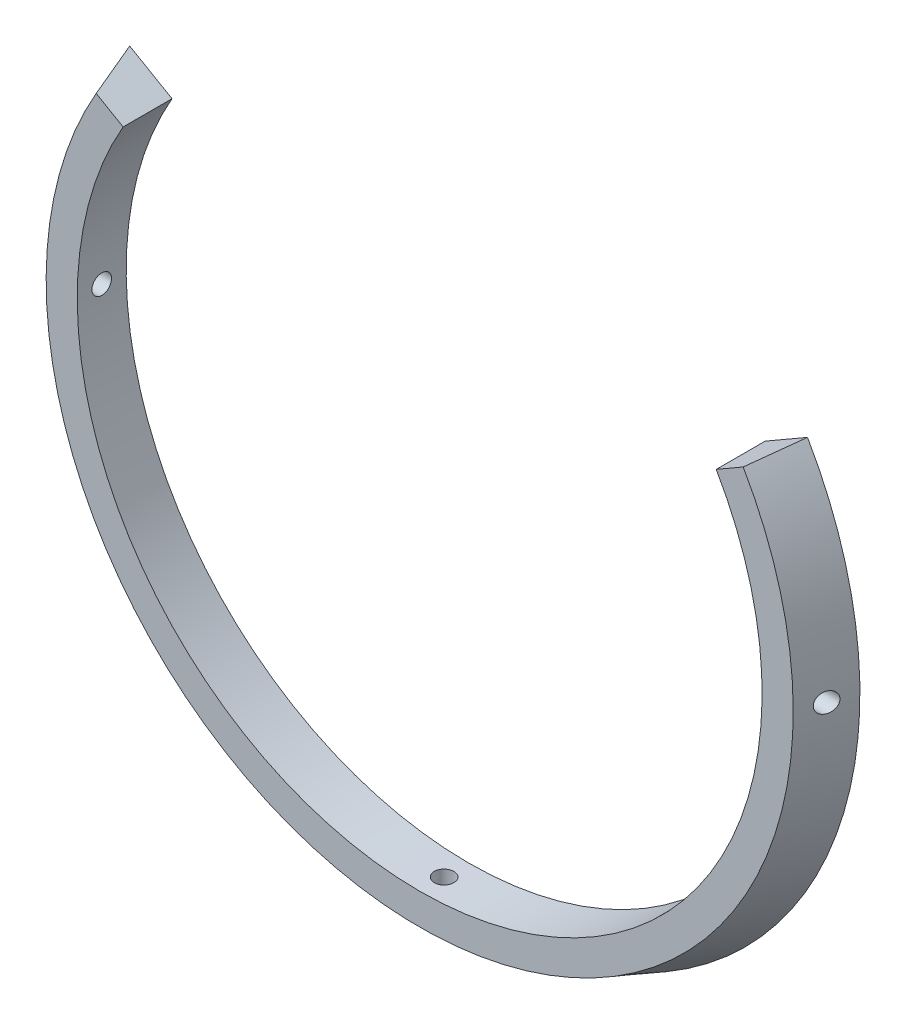
ISO-10303-21;
HEADER;
FILE_DESCRIPTION(('STEP AP214'),'2;1');
FILE_NAME('part.step','',(''),(''),'','','');
FILE_SCHEMA(('AUTOMOTIVE_DESIGN { 1 0 10303 214 1 1 1 1 }'));
ENDSEC;
DATA;
#1=APPLICATION_CONTEXT('core data for automotive mechanical design processes');
#2=APPLICATION_PROTOCOL_DEFINITION('international standard','automotive_design',2000,#1);
#3=PRODUCT_CONTEXT('',#1,'mechanical');
#4=PRODUCT('Part','Part','',(#3));
#5=PRODUCT_RELATED_PRODUCT_CATEGORY('part','',(#4));
#6=PRODUCT_DEFINITION_FORMATION('','',#4);
#7=PRODUCT_DEFINITION_CONTEXT('part definition',#1,'design');
#8=PRODUCT_DEFINITION('design','',#6,#7);
#9=PRODUCT_DEFINITION_SHAPE('','',#8);
#10=(LENGTH_UNIT() NAMED_UNIT(*) SI_UNIT(.MILLI.,.METRE.));
#11=(NAMED_UNIT(*) PLANE_ANGLE_UNIT() SI_UNIT($,.RADIAN.));
#12=(NAMED_UNIT(*) SI_UNIT($,.STERADIAN.) SOLID_ANGLE_UNIT());
#13=UNCERTAINTY_MEASURE_WITH_UNIT(LENGTH_MEASURE(1.E-05),#10,'distance_accuracy_value','');
#14=(GEOMETRIC_REPRESENTATION_CONTEXT(3) GLOBAL_UNCERTAINTY_ASSIGNED_CONTEXT((#13)) GLOBAL_UNIT_ASSIGNED_CONTEXT((#10,
#11,#12)) REPRESENTATION_CONTEXT('',''));
#15=CARTESIAN_POINT('',(0.,0.,0.));
#16=DIRECTION('',(0.,0.,1.));
#17=DIRECTION('',(1.,0.,0.));
#18=AXIS2_PLACEMENT_3D('',#15,#16,#17);
#19=CARTESIAN_POINT('',(0.,0.,10.));
#20=DIRECTION('',(0.,0.,1.));
#21=DIRECTION('',(1.,0.,0.));
#22=AXIS2_PLACEMENT_3D('',#19,#20,#21);
#23=PLANE('',#22);
#24=DIRECTION('',(-0.86602540378444,-0.499999999999998,0.));
#25=VECTOR('',#24,1.);
#26=CARTESIAN_POINT('',(60.6217782649107,35.0000000000001,10.));
#27=LINE('',#26,#25);
#28=CARTESIAN_POINT('',(66.129957611796,38.180148828669,10.));
#29=VERTEX_POINT('',#28);
#30=CARTESIAN_POINT('',(60.6217782649107,35.0000000000001,10.));
#31=VERTEX_POINT('',#30);
#32=EDGE_CURVE('E55',#29,#31,#27,.T.);
#33=ORIENTED_EDGE('',*,*,#32,.T.);
#34=CARTESIAN_POINT('',(0.,0.,10.));
#35=DIRECTION('',(0.,0.,1.));
#36=DIRECTION('',(1.,0.,0.));
#37=AXIS2_PLACEMENT_3D('',#34,#35,#36);
#38=CIRCLE('',#37,70.);
#39=CARTESIAN_POINT('',(-60.6217782649108,34.9999999999999,10.));
#40=VERTEX_POINT('',#39);
#41=EDGE_CURVE('E95',#40,#31,#38,.T.);
#42=ORIENTED_EDGE('',*,*,#41,.F.);
#43=DIRECTION('',(-0.866025403784439,0.499999999999999,0.));
#44=VECTOR('',#43,1.);
#45=CARTESIAN_POINT('',(-60.6217782649108,34.9999999999999,10.));
#46=LINE('',#45,#44);
#47=CARTESIAN_POINT('',(-66.1299576117961,38.1801488286688,10.));
#48=VERTEX_POINT('',#47);
#49=EDGE_CURVE('E79',#40,#48,#46,.T.);
#50=ORIENTED_EDGE('',*,*,#49,.T.);
#51=CARTESIAN_POINT('',(0.,0.,10.));
#52=DIRECTION('',(0.,0.,1.));
#53=DIRECTION('',(1.,0.,0.));
#54=AXIS2_PLACEMENT_3D('',#51,#52,#53);
#55=CIRCLE('',#54,76.3602976573379);
#56=EDGE_CURVE('E103',#48,#29,#55,.T.);
#57=ORIENTED_EDGE('',*,*,#56,.T.);
#58=EDGE_LOOP('',(#33,#42,#50,#57));
#59=FACE_BOUND('',#58,.T.);
#60=ADVANCED_FACE('F39',(#59),#23,.T.);
#61=CARTESIAN_POINT('',(0.,0.,0.));
#62=DIRECTION('',(0.,0.,1.));
#63=DIRECTION('',(1.,0.,0.));
#64=AXIS2_PLACEMENT_3D('',#61,#62,#63);
#65=PLANE('',#64);
#66=CARTESIAN_POINT('',(0.,0.,0.));
#67=DIRECTION('',(0.,0.,1.));
#68=DIRECTION('',(1.,0.,0.));
#69=AXIS2_PLACEMENT_3D('',#66,#67,#68);
#70=CIRCLE('',#69,70.);
#71=CARTESIAN_POINT('',(-60.6217782649108,34.9999999999999,0.));
#72=VERTEX_POINT('',#71);
#73=CARTESIAN_POINT('',(60.6217782649107,35.0000000000001,0.));
#74=VERTEX_POINT('',#73);
#75=EDGE_CURVE('E97',#72,#74,#70,.T.);
#76=ORIENTED_EDGE('',*,*,#75,.T.);
#77=DIRECTION('',(-0.86602540378444,-0.499999999999998,0.));
#78=VECTOR('',#77,1.);
#79=CARTESIAN_POINT('',(60.6217782649107,35.0000000000001,0.));
#80=LINE('',#79,#78);
#81=CARTESIAN_POINT('',(69.2820323027551,40.0000000000001,0.));
#82=VERTEX_POINT('',#81);
#83=EDGE_CURVE('E87',#82,#74,#80,.T.);
#84=ORIENTED_EDGE('',*,*,#83,.F.);
#85=CARTESIAN_POINT('',(0.,0.,0.));
#86=DIRECTION('',(0.,0.,1.));
#87=DIRECTION('',(1.,0.,0.));
#88=AXIS2_PLACEMENT_3D('',#85,#86,#87);
#89=CIRCLE('',#88,80.);
#90=CARTESIAN_POINT('',(-69.2820323027552,39.9999999999998,0.));
#91=VERTEX_POINT('',#90);
#92=EDGE_CURVE('E100',#91,#82,#89,.T.);
#93=ORIENTED_EDGE('',*,*,#92,.F.);
#94=DIRECTION('',(-0.866025403784439,0.499999999999999,0.));
#95=VECTOR('',#94,1.);
#96=CARTESIAN_POINT('',(-60.6217782649108,34.9999999999999,0.));
#97=LINE('',#96,#95);
#98=EDGE_CURVE('E63',#72,#91,#97,.T.);
#99=ORIENTED_EDGE('',*,*,#98,.F.);
#100=EDGE_LOOP('',(#76,#84,#93,#99));
#101=FACE_BOUND('',#100,.T.);
#102=ADVANCED_FACE('F140',(#101),#65,.F.);
#103=CARTESIAN_POINT('',(0.,0.,10.));
#104=DIRECTION('',(0.,0.,-1.));
#105=DIRECTION('',(-1.,0.,0.));
#106=AXIS2_PLACEMENT_3D('',#103,#104,#105);
#107=CYLINDRICAL_SURFACE('',#106,70.);
#108=DIRECTION('',(0.,0.,-1.));
#109=VECTOR('',#108,1.);
#110=CARTESIAN_POINT('',(60.6217782649107,35.0000000000001,10.));
#111=LINE('',#110,#109);
#112=EDGE_CURVE('E98',#31,#74,#111,.T.);
#113=ORIENTED_EDGE('',*,*,#112,.T.);
#114=ORIENTED_EDGE('',*,*,#75,.F.);
#115=DIRECTION('',(0.,0.,-1.));
#116=VECTOR('',#115,1.);
#117=CARTESIAN_POINT('',(-60.6217782649108,34.9999999999999,10.));
#118=LINE('',#117,#116);
#119=EDGE_CURVE('E82',#40,#72,#118,.T.);
#120=ORIENTED_EDGE('',*,*,#119,.F.);
#121=ORIENTED_EDGE('',*,*,#41,.T.);
#122=EDGE_LOOP('',(#113,#114,#120,#121));
#123=FACE_BOUND('',#122,.T.);
#124=CARTESIAN_POINT('',(-70.,0.,7.));
#125=CARTESIAN_POINT('',(-69.9999996149301,-0.112316286819579,6.9999950267639));
#126=CARTESIAN_POINT('',(-69.9997267795291,-0.22471342997171,6.99050703224014));
#127=CARTESIAN_POINT('',(-69.9986646136778,-0.446410553862827,6.9527901476384));
#128=CARTESIAN_POINT('',(-69.9978746658476,-0.555706669347092,6.92453885549852));
#129=CARTESIAN_POINT('',(-69.9958677372696,-0.767957929736816,6.85010179463942));
#130=CARTESIAN_POINT('',(-69.9946509649922,-0.87091614140713,6.80392478006115));
#131=CARTESIAN_POINT('',(-69.9919276478776,-1.06759056641175,6.69495957691114));
#132=CARTESIAN_POINT('',(-69.9904211739247,-1.16130903206028,6.63217545036122));
#133=CARTESIAN_POINT('',(-69.9872873693094,-1.33691253467475,6.49174660446556));
#134=CARTESIAN_POINT('',(-69.9856599954017,-1.41879330619821,6.41409655183108));
#135=CARTESIAN_POINT('',(-69.9824681885537,-1.56836130928542,6.24614917051025));
#136=CARTESIAN_POINT('',(-69.9809037581189,-1.63604797630621,6.15585133902119));
#137=CARTESIAN_POINT('',(-69.9780140529026,-1.7553123955798,5.96515663556667));
#138=CARTESIAN_POINT('',(-69.9766888146437,-1.80688768863881,5.86475822496678));
#139=CARTESIAN_POINT('',(-69.9744273153638,-1.89244927623031,5.65672329656314));
#140=CARTESIAN_POINT('',(-69.973491052855,-1.92643563804235,5.5490868064476));
#141=CARTESIAN_POINT('',(-69.9721133803398,-1.97584572344314,5.32966240508293));
#142=CARTESIAN_POINT('',(-69.9716718344362,-1.99127454481841,5.21787564262265));
#143=CARTESIAN_POINT('',(-69.9713329721672,-2.00314728057876,4.99329793715254));
#144=CARTESIAN_POINT('',(-69.9714356537402,-1.99959126688359,4.88050699794842));
#145=CARTESIAN_POINT('',(-69.9721735406433,-1.97359959837663,4.65715724822532));
#146=CARTESIAN_POINT('',(-69.9728085904297,-1.95116945807543,4.54659779538663));
#147=CARTESIAN_POINT('',(-69.9745393792642,-1.88807477316335,4.33081424240121));
#148=CARTESIAN_POINT('',(-69.9756351192776,-1.84741019035064,4.22559015343278));
#149=CARTESIAN_POINT('',(-69.9781639448389,-1.74899461408696,4.02344654515124));
#150=CARTESIAN_POINT('',(-69.9795970802915,-1.69124109265352,3.92652825726049));
#151=CARTESIAN_POINT('',(-69.9826390852555,-1.56028893983692,3.74376093497471));
#152=CARTESIAN_POINT('',(-69.9842479551246,-1.48709027702538,3.65791192310447));
#153=CARTESIAN_POINT('',(-69.9874607520489,-1.32729448416521,3.499687961224));
#154=CARTESIAN_POINT('',(-69.9890646771303,-1.24069257101229,3.42731784170601));
#155=CARTESIAN_POINT('',(-69.992086216381,-1.05656547595005,3.29814318835196));
#156=CARTESIAN_POINT('',(-69.9935038305206,-0.959040292307037,3.24133865698642));
#157=CARTESIAN_POINT('',(-69.9959929601536,-0.755832383316455,3.14490820999497));
#158=CARTESIAN_POINT('',(-69.9970644726067,-0.650149586319754,3.10528244527212));
#159=CARTESIAN_POINT('',(-69.998740560809,-0.433627626635332,3.04433744976672));
#160=CARTESIAN_POINT('',(-69.9993451377131,-0.32278847670069,3.02301817370973));
#161=CARTESIAN_POINT('',(-70.0000190557424,-0.0991421242368263,2.99929725237571));
#162=CARTESIAN_POINT('',(-70.0000885859641,0.0136643688651155,2.99688892358131));
#163=CARTESIAN_POINT('',(-69.9996850736081,0.238080082195189,3.0110408451527));
#164=CARTESIAN_POINT('',(-69.9992120315984,0.34968930367652,3.0276010756619));
#165=CARTESIAN_POINT('',(-69.9977768109445,0.568523644914071,3.0792144975015));
#166=CARTESIAN_POINT('',(-69.9968147125393,0.675749480732105,3.11426465523893));
#167=CARTESIAN_POINT('',(-69.9945097982842,0.88279525980865,3.20185990010615));
#168=CARTESIAN_POINT('',(-69.9931669817451,0.982615189661706,3.25440501890269));
#169=CARTESIAN_POINT('',(-69.9902514416955,1.17204638387366,3.37551582705261));
#170=CARTESIAN_POINT('',(-69.9886786536726,1.26165477106143,3.44408601505651));
#171=CARTESIAN_POINT('',(-69.9854806448697,1.42809032373543,3.59529389364271));
#172=CARTESIAN_POINT('',(-69.9838554239662,1.50491745912272,3.67793161735211));
#173=CARTESIAN_POINT('',(-69.9807352286952,1.64363195956651,3.85495740843334));
#174=CARTESIAN_POINT('',(-69.9792402920053,1.70551501194769,3.94934885589982));
#175=CARTESIAN_POINT('',(-69.9765498058537,1.81255521173305,4.1471853836391));
#176=CARTESIAN_POINT('',(-69.9753542557507,1.85771239495969,4.25063044452081));
#177=CARTESIAN_POINT('',(-69.9733976072276,1.93001145871094,4.46362152081525));
#178=CARTESIAN_POINT('',(-69.9726364414488,1.95715613248458,4.5731665874263));
#179=CARTESIAN_POINT('',(-69.9716341916415,1.99266879934611,4.7952615576871));
#180=CARTESIAN_POINT('',(-69.9713931072851,2.00103680426867,4.9078114594429));
#181=CARTESIAN_POINT('',(-69.9714582263741,1.99875826618365,5.13267799559717));
#182=CARTESIAN_POINT('',(-69.9717642339433,1.98811852855175,5.24499469907439));
#183=CARTESIAN_POINT('',(-69.9728886283733,1.94814051555171,5.46624698819508));
#184=CARTESIAN_POINT('',(-69.9737070162513,1.91880220305912,5.57518256712514));
#185=CARTESIAN_POINT('',(-69.9757638856832,1.84226071428733,5.78658309985461));
#186=CARTESIAN_POINT('',(-69.9770023743709,1.79505723463408,5.88904794373794));
#187=CARTESIAN_POINT('',(-69.9797597735442,1.68412788465913,6.08459612389776));
#188=CARTESIAN_POINT('',(-69.9812786738076,1.62040261659421,6.17767980196738));
#189=CARTESIAN_POINT('',(-69.9844262043485,1.47821932776609,6.35185415650389));
#190=CARTESIAN_POINT('',(-69.9860548621276,1.39975760566038,6.43294181077273));
#191=CARTESIAN_POINT('',(-69.9892384419302,1.23031167777013,6.58081590412606));
#192=CARTESIAN_POINT('',(-69.9907933455894,1.13932437498507,6.64759879582973));
#193=CARTESIAN_POINT('',(-69.9936546482795,0.947376333784992,6.76497796729639));
#194=CARTESIAN_POINT('',(-69.9949608895645,0.84640932575075,6.81556398590642));
#195=CARTESIAN_POINT('',(-69.997174758846,0.637489831058708,6.89900777180388));
#196=CARTESIAN_POINT('',(-69.9980828621709,0.529545851780355,6.93188668999595));
#197=CARTESIAN_POINT('',(-69.999155297125,0.350766202848949,6.97026513018611));
#198=CARTESIAN_POINT('',(-69.9994706871964,0.281091074513447,6.98140168654489));
#199=CARTESIAN_POINT('',(-69.9998931594471,0.140954580982318,6.99627068114412));
#200=CARTESIAN_POINT('',(-70.0000002416819,0.0704932159963146,7.00000312135859));
#201=CARTESIAN_POINT('',(-70.,0.,7.));
#202=B_SPLINE_CURVE_WITH_KNOTS('',3,(#124,#125,#126,#127,#128,#129,#130,#131,#132,#133,#134,
#135,#136,#137,#138,#139,#140,#141,#142,#143,#144,#145,#146,#147,#148,#149,#150,#151,#152,#153,
#154,#155,#156,#157,#158,#159,#160,#161,#162,#163,#164,#165,#166,#167,#168,#169,#170,#171,#172,
#173,#174,#175,#176,#177,#178,#179,#180,#181,#182,#183,#184,#185,#186,#187,#188,#189,#190,#191,
#192,#193,#194,#195,#196,#197,#198,#199,#200,#201),.UNSPECIFIED.,.T.,.F.,(4,2,2,2,2,2,2,2,2,2,2,
2,2,2,2,2,2,2,2,2,2,2,2,2,2,2,2,2,2,2,2,2,2,2,2,2,2,2,4),(0.,0.33669155192478,0.673785814333229,
1.01071566128574,1.34756317285995,1.68453175883004,2.02151374453114,2.35854714108932,
2.69557924844919,3.03251875138119,3.36945697789516,3.70629679431785,4.04313731643577,
4.38002769261651,4.71691875432201,5.053930317878,5.39094193492301,5.72795651231158,
6.06497025621467,6.401864887172,6.73875916546293,7.07559818759242,7.41243781942056,
7.74937212465422,8.08630722333276,8.42333944137427,8.76037093757629,9.09735015716261,
9.43432916435557,9.77118754653683,10.1080465975243,10.4449113690785,10.7817638628713,
11.118701077036,11.4557217504231,11.7929555149021,12.1297855594659,12.3411037689078,
12.5524219220096),.UNSPECIFIED.);
#203=CARTESIAN_POINT('',(-70.,0.,7.));
#204=VERTEX_POINT('',#203);
#205=EDGE_CURVE('E122',#204,#204,#202,.T.);
#206=ORIENTED_EDGE('',*,*,#205,.F.);
#207=EDGE_LOOP('',(#206));
#208=FACE_BOUND('',#207,.T.);
#209=CARTESIAN_POINT('',(69.9714227381436,-1.99999999999976,5.));
#210=CARTESIAN_POINT('',(69.9714231238183,-1.99999502675404,5.11231627626728));
#211=CARTESIAN_POINT('',(69.9716960736724,-1.9905070339528,5.2247134089035));
#212=CARTESIAN_POINT('',(69.9727586480219,-1.95279015681525,5.44641051094482));
#213=CARTESIAN_POINT('',(69.9735488901127,-1.92453887038146,5.55570661508697));
#214=CARTESIAN_POINT('',(69.9755564575778,-1.85010182621802,5.76795785150267));
#215=CARTESIAN_POINT('',(69.9767735744503,-1.80392482290176,5.87091605063715));
#216=CARTESIAN_POINT('',(69.9794974800477,-1.69495964626504,6.06759045467621));
#217=CARTESIAN_POINT('',(69.9810041979133,-1.63217553493837,6.16130891187906));
#218=CARTESIAN_POINT('',(69.9841382834661,-1.49174670435497,6.33691242418744));
#219=CARTESIAN_POINT('',(69.9857656943517,-1.41409664841504,6.41879321113774));
#220=CARTESIAN_POINT('',(69.9889573514533,-1.24614925402665,6.56836124395446));
#221=CARTESIAN_POINT('',(69.9905215951553,-1.15585141281731,6.63604792532515));
#222=CARTESIAN_POINT('',(69.9934107848757,-0.965156701002657,6.7553123594821));
#223=CARTESIAN_POINT('',(69.9947356943895,-0.864758293432882,6.80688765574423));
#224=CARTESIAN_POINT('',(69.99699653843,-0.6567233716185,6.89244925009598));
#225=CARTESIAN_POINT('',(69.9979324744437,-0.549086885046034,6.92643561542612));
#226=CARTESIAN_POINT('',(69.9993096395834,-0.329662493895554,6.97584570835971));
#227=CARTESIAN_POINT('',(69.9997510045732,-0.217875738161317,6.99127453399525));
#228=CARTESIAN_POINT('',(70.0000897297399,0.00670195418632373,7.00314728060595));
#229=CARTESIAN_POINT('',(69.9999870919762,0.119492886996381,6.99959127345613));
#230=CARTESIAN_POINT('',(69.9992494982118,0.34284266594091,6.97359961517955));
#231=CARTESIAN_POINT('',(69.9986146975092,0.453402153627216,6.95116947197816));
#232=CARTESIAN_POINT('',(69.9968845028025,0.669185774814628,6.88807476913466));
#233=CARTESIAN_POINT('',(69.9957891078353,0.774409897156294,6.84741017135516));
#234=CARTESIAN_POINT('',(69.9932609176104,0.97655354537753,6.74899456437675));
#235=CARTESIAN_POINT('',(69.9918280725097,1.0734718415578,6.69124103073276));
#236=CARTESIAN_POINT('',(69.9887864660215,1.25623917521772,6.56028885200202));
#237=CARTESIAN_POINT('',(69.9871777042759,1.34208819016688,6.48709017547893));
#238=CARTESIAN_POINT('',(69.9839648944655,1.50031213606595,6.32729437305403));
#239=CARTESIAN_POINT('',(69.9823608482914,1.57268223930589,6.24069246680546));
#240=CARTESIAN_POINT('',(69.9793388901707,1.70185686313033,6.05656539129828));
#241=CARTESIAN_POINT('',(69.9779209782541,1.75866138121188,5.95904022028323));
#242=CARTESIAN_POINT('',(69.9754312067162,1.8550918187047,5.75583231436665));
#243=CARTESIAN_POINT('',(69.9743593502185,1.89471758305117,5.65014950583999));
#244=CARTESIAN_POINT('',(69.9726826787657,1.9556625742554,5.43362752114664));
#245=CARTESIAN_POINT('',(69.9720778626536,1.97698184645549,5.32278835775215));
#246=CARTESIAN_POINT('',(69.9714036762256,2.00070275329976,5.09914199958247));
#247=CARTESIAN_POINT('',(69.971334116635,2.00311107513912,4.98633551462495));
#248=CARTESIAN_POINT('',(69.9717377926111,1.98895914256621,4.76191981926658));
#249=CARTESIAN_POINT('',(69.9722110276096,1.97239890800966,4.65031060761257));
#250=CARTESIAN_POINT('',(69.9736467719771,1.92078548785051,4.43147631245504));
#251=CARTESIAN_POINT('',(69.9746092009764,1.88573533992478,4.32425051192518));
#252=CARTESIAN_POINT('',(69.9769147691608,1.79814012653355,4.11720479906834));
#253=CARTESIAN_POINT('',(69.9782579090362,1.74559502934409,4.01738490017104));
#254=CARTESIAN_POINT('',(69.9811739475789,1.62448425250762,3.82795372619314));
#255=CARTESIAN_POINT('',(69.9827469107957,1.55591406871079,3.73834533179986));
#256=CARTESIAN_POINT('',(69.9859450444677,1.40470619449625,3.57190976262062));
#257=CARTESIAN_POINT('',(69.9875702150457,1.32206847098502,3.49508261790305));
#258=CARTESIAN_POINT('',(69.9906901062704,1.14504267565838,3.35636809851705));
#259=CARTESIAN_POINT('',(69.9921847891808,1.05065122374696,3.29448503652385));
#260=CARTESIAN_POINT('',(69.9948746753992,0.852814684669638,3.18744481984658));
#261=CARTESIAN_POINT('',(69.9960698793486,0.749369616894758,3.14228762934014));
#262=CARTESIAN_POINT('',(69.9980258949552,0.536378545943138,3.06998856049731));
#263=CARTESIAN_POINT('',(69.9987867740378,0.426833492636352,3.04284388576616));
#264=CARTESIAN_POINT('',(69.9997886356965,0.204738550335595,3.00733121247719));
#265=CARTESIAN_POINT('',(70.0000296185984,0.0921886632243267,2.99896320215497));
#266=CARTESIAN_POINT('',(69.9999645264886,-0.132677883185284,3.00124172501293));
#267=CARTESIAN_POINT('',(69.9996586470866,-0.244994611496783,3.01188145922468));
#268=CARTESIAN_POINT('',(69.9985346821139,-0.466246951108139,3.05185947414586));
#269=CARTESIAN_POINT('',(69.9977165955274,-0.575182555702697,3.08119779193503));
#270=CARTESIAN_POINT('',(69.995660369941,-0.786583138015269,3.1577393003993));
#271=CARTESIAN_POINT('',(69.9944222238089,-0.889048005830298,3.20494279441239));
#272=CARTESIAN_POINT('',(69.9916654008008,-1.08459622782332,3.3158721804715));
#273=CARTESIAN_POINT('',(69.9901467341515,-1.17767992380908,3.37959747023504));
#274=CARTESIAN_POINT('',(69.9869994602913,-1.35185427591267,3.5217807823478));
#275=CARTESIAN_POINT('',(69.9853708255623,-1.43294191384796,3.60024250111976));
#276=CARTESIAN_POINT('',(69.9821870705158,-1.58081597581039,3.76968841570422));
#277=CARTESIAN_POINT('',(69.980631968508,-1.64759885241486,3.86067570855232));
#278=CARTESIAN_POINT('',(69.9777701343522,-1.76497800828903,4.05262374225482));
#279=CARTESIAN_POINT('',(69.9764635599095,-1.81556402351624,4.1535907544926));
#280=CARTESIAN_POINT('',(69.9742490364097,-1.89900780191096,4.36251025821094));
#281=CARTESIAN_POINT('',(69.973340612009,-1.93188671603773,4.47045424228924));
#282=CARTESIAN_POINT('',(69.9722677777788,-1.97026514435515,4.64923388028236));
#283=CARTESIAN_POINT('',(69.9719522635747,-1.9814016953847,4.71890899204159));
#284=CARTESIAN_POINT('',(69.9715296227542,-1.99627068290073,4.85904545233529));
#285=CARTESIAN_POINT('',(69.9714224960822,-2.00000312136394,4.92950680065986));
#286=CARTESIAN_POINT('',(69.9714227381436,-1.99999999999976,5.));
#287=B_SPLINE_CURVE_WITH_KNOTS('',3,(#209,#210,#211,#212,#213,#214,#215,#216,#217,#218,#219,
#220,#221,#222,#223,#224,#225,#226,#227,#228,#229,#230,#231,#232,#233,#234,#235,#236,#237,#238,
#239,#240,#241,#242,#243,#244,#245,#246,#247,#248,#249,#250,#251,#252,#253,#254,#255,#256,#257,
#258,#259,#260,#261,#262,#263,#264,#265,#266,#267,#268,#269,#270,#271,#272,#273,#274,#275,#276,
#277,#278,#279,#280,#281,#282,#283,#284,#285,#286),.UNSPECIFIED.,.T.,.F.,(4,2,2,2,2,2,2,2,2,2,2,
2,2,2,2,2,2,2,2,2,2,2,2,2,2,2,2,2,2,2,2,2,2,2,2,2,2,2,4),(0.,0.336691520235285,
0.673785751642736,1.01071556244788,1.34756303843135,1.68453166585155,2.02151369188248,
2.35854707295776,2.69557916558276,3.03251864931804,3.36945685742908,3.70629677298028,
4.04313739303613,4.38002779738141,4.71691888742463,5.05393040988238,5.39094198653128,
5.72795660516683,6.06497038906744,6.40186499447931,6.73875924724048,7.07559816943898,
7.41243770243796,7.74937202458294,8.08630713936774,8.42333937352027,8.7603708858353,
9.09735006266342,9.43432902835954,9.77118748261707,10.1080466048751,10.4449114470183,
10.7817640108793,11.118701182514,11.4557218143517,11.7929555972975,12.1297856592767,
12.3411038188292,12.552421921965),.UNSPECIFIED.);
#288=CARTESIAN_POINT('',(69.9714227381436,-1.99999999999976,5.));
#289=VERTEX_POINT('',#288);
#290=EDGE_CURVE('E144',#289,#289,#287,.T.);
#291=ORIENTED_EDGE('',*,*,#290,.F.);
#292=EDGE_LOOP('',(#291));
#293=FACE_BOUND('',#292,.T.);
#294=CARTESIAN_POINT('',(0.,-70.,7.));
#295=CARTESIAN_POINT('',(0.112316286819579,-69.9999996149301,6.99999502676388));
#296=CARTESIAN_POINT('',(0.224713429971709,-69.9997267795291,6.99050703224011));
#297=CARTESIAN_POINT('',(0.446410553862821,-69.9986646136778,6.95279014763834));
#298=CARTESIAN_POINT('',(0.555706669347082,-69.9978746658476,6.92453885549845));
#299=CARTESIAN_POINT('',(0.767957929736797,-69.9958677372696,6.85010179463933));
#300=CARTESIAN_POINT('',(0.870916141407106,-69.9946509649922,6.80392478006104));
#301=CARTESIAN_POINT('',(1.06759056641172,-69.9919276478776,6.69495957691101));
#302=CARTESIAN_POINT('',(1.16130903206023,-69.9904211739247,6.63217545036108));
#303=CARTESIAN_POINT('',(1.33691253467469,-69.9872873693094,6.49174660446539));
#304=CARTESIAN_POINT('',(1.41879330619814,-69.9856599954017,6.41409655183091));
#305=CARTESIAN_POINT('',(1.56836130928533,-69.9824681885537,6.24614917051006));
#306=CARTESIAN_POINT('',(1.63604797630611,-69.9809037581189,6.15585133902099));
#307=CARTESIAN_POINT('',(1.75531239557967,-69.9780140529026,5.96515663556645));
#308=CARTESIAN_POINT('',(1.80688768863867,-69.9766888146437,5.86475822496655));
#309=CARTESIAN_POINT('',(1.89244927623015,-69.9744273153638,5.65672329656291));
#310=CARTESIAN_POINT('',(1.92643563804217,-69.973491052855,5.54908680644736));
#311=CARTESIAN_POINT('',(1.97584572344294,-69.9721133803398,5.32966240508269));
#312=CARTESIAN_POINT('',(1.99127454481819,-69.9716718344362,5.21787564262241));
#313=CARTESIAN_POINT('',(2.00314728057852,-69.9713329721672,4.9932979371523));
#314=CARTESIAN_POINT('',(1.99959126688333,-69.9714356537402,4.88050699794818));
#315=CARTESIAN_POINT('',(1.97359959837635,-69.9721735406434,4.65715724822507));
#316=CARTESIAN_POINT('',(1.95116945807513,-69.9728085904297,4.54659779538639));
#317=CARTESIAN_POINT('',(1.88807477316303,-69.9745393792642,4.33081424240098));
#318=CARTESIAN_POINT('',(1.8474101903503,-69.9756351192776,4.22559015343256));
#319=CARTESIAN_POINT('',(1.7489946140866,-69.9781639448389,4.02344654515103));
#320=CARTESIAN_POINT('',(1.69124109265314,-69.9795970802915,3.92652825726028));
#321=CARTESIAN_POINT('',(1.56028893983653,-69.9826390852555,3.74376093497452));
#322=CARTESIAN_POINT('',(1.48709027702497,-69.9842479551246,3.65791192310429));
#323=CARTESIAN_POINT('',(1.32729448416478,-69.9874607520489,3.49968796122384));
#324=CARTESIAN_POINT('',(1.24069257101185,-69.9890646771303,3.42731784170585));
#325=CARTESIAN_POINT('',(1.0565654759496,-69.992086216381,3.29814318835183));
#326=CARTESIAN_POINT('',(0.959040292306577,-69.9935038305206,3.2413386569863));
#327=CARTESIAN_POINT('',(0.755832383315983,-69.9959929601536,3.14490820999488));
#328=CARTESIAN_POINT('',(0.650149586319278,-69.9970644726067,3.10528244527204));
#329=CARTESIAN_POINT('',(0.433627626634848,-69.998740560809,3.04433744976667));
#330=CARTESIAN_POINT('',(0.322788476700203,-69.9993451377131,3.02301817370969));
#331=CARTESIAN_POINT('',(0.0991421242363362,-70.0000190557424,2.9992972523757));
#332=CARTESIAN_POINT('',(-0.0136643688656057,-70.0000885859641,2.99688892358131));
#333=CARTESIAN_POINT('',(-0.238080082195677,-69.9996850736081,3.01104084515273));
#334=CARTESIAN_POINT('',(-0.349689303677007,-69.9992120315984,3.02760107566194));
#335=CARTESIAN_POINT('',(-0.568523644914551,-69.9977768109445,3.07921449750157));
#336=CARTESIAN_POINT('',(-0.67574948073258,-69.9968147125393,3.11426465523901));
#337=CARTESIAN_POINT('',(-0.882795259809115,-69.9945097982842,3.20185990010626));
#338=CARTESIAN_POINT('',(-0.982615189662164,-69.9931669817451,3.25440501890281));
#339=CARTESIAN_POINT('',(-1.1720463838741,-69.9902514416955,3.37551582705275));
#340=CARTESIAN_POINT('',(-1.26165477106187,-69.9886786536726,3.44408601505667));
#341=CARTESIAN_POINT('',(-1.42809032373585,-69.9854806448697,3.59529389364288));
#342=CARTESIAN_POINT('',(-1.50491745912313,-69.9838554239662,3.67793161735229));
#343=CARTESIAN_POINT('',(-1.64363195956689,-69.9807352286952,3.85495740843354));
#344=CARTESIAN_POINT('',(-1.70551501194806,-69.9792402920053,3.94934885590003));
#345=CARTESIAN_POINT('',(-1.8125552117334,-69.9765498058537,4.14718538363932));
#346=CARTESIAN_POINT('',(-1.85771239496003,-69.9753542557507,4.25063044452104));
#347=CARTESIAN_POINT('',(-1.93001145871125,-69.9733976072276,4.46362152081549));
#348=CARTESIAN_POINT('',(-1.95715613248488,-69.9726364414488,4.57316658742654));
#349=CARTESIAN_POINT('',(-1.99266879934638,-69.9716341916415,4.79526155768735));
#350=CARTESIAN_POINT('',(-2.00103680426893,-69.9713931072851,4.90781145944315));
#351=CARTESIAN_POINT('',(-1.99875826618387,-69.9714582263741,5.13267799559741));
#352=CARTESIAN_POINT('',(-1.98811852855196,-69.9717642339433,5.24499469907464));
#353=CARTESIAN_POINT('',(-1.9481405155519,-69.9728886283733,5.46624698819532));
#354=CARTESIAN_POINT('',(-1.9188022030593,-69.9737070162513,5.57518256712538));
#355=CARTESIAN_POINT('',(-1.84226071428748,-69.9757638856832,5.78658309985484));
#356=CARTESIAN_POINT('',(-1.79505723463422,-69.9770023743709,5.88904794373816));
#357=CARTESIAN_POINT('',(-1.68412788465924,-69.9797597735442,6.08459612389797));
#358=CARTESIAN_POINT('',(-1.62040261659431,-69.9812786738076,6.17767980196757));
#359=CARTESIAN_POINT('',(-1.47821932776616,-69.9844262043485,6.35185415650407));
#360=CARTESIAN_POINT('',(-1.39975760566045,-69.9860548621276,6.4329418107729));
#361=CARTESIAN_POINT('',(-1.23031167777018,-69.9892384419302,6.58081590412621));
#362=CARTESIAN_POINT('',(-1.13932437498511,-69.9907933455894,6.64759879582988));
#363=CARTESIAN_POINT('',(-0.94737633378502,-69.9936546482795,6.7649779672965));
#364=CARTESIAN_POINT('',(-0.846409325750771,-69.9949608895645,6.81556398590652));
#365=CARTESIAN_POINT('',(-0.637489831058719,-69.997174758846,6.89900777180396));
#366=CARTESIAN_POINT('',(-0.529545851780362,-69.9980828621709,6.93188668999602));
#367=CARTESIAN_POINT('',(-0.350766202848951,-69.999155297125,6.97026513018616));
#368=CARTESIAN_POINT('',(-0.281091074513448,-69.9994706871964,6.98140168654493));
#369=CARTESIAN_POINT('',(-0.140954580982317,-69.9998931594471,6.99627068114414));
#370=CARTESIAN_POINT('',(-0.0704932159963141,-70.0000002416819,7.0000031213586));
#371=CARTESIAN_POINT('',(0.,-70.,7.));
#372=B_SPLINE_CURVE_WITH_KNOTS('',3,(#294,#295,#296,#297,#298,#299,#300,#301,#302,#303,#304,
#305,#306,#307,#308,#309,#310,#311,#312,#313,#314,#315,#316,#317,#318,#319,#320,#321,#322,#323,
#324,#325,#326,#327,#328,#329,#330,#331,#332,#333,#334,#335,#336,#337,#338,#339,#340,#341,#342,
#343,#344,#345,#346,#347,#348,#349,#350,#351,#352,#353,#354,#355,#356,#357,#358,#359,#360,#361,
#362,#363,#364,#365,#366,#367,#368,#369,#370,#371),.UNSPECIFIED.,.T.,.F.,(4,2,2,2,2,2,2,2,2,2,2,
2,2,2,2,2,2,2,2,2,2,2,2,2,2,2,2,2,2,2,2,2,2,2,2,2,2,2,4),(0.,0.33669155192478,0.673785814333229,
1.01071566128574,1.34756317285995,1.68453175883004,2.02151374453114,2.35854714108932,
2.69557924844919,3.03251875138119,3.36945697789516,3.70629679431785,4.04313731643576,
4.38002769261651,4.71691875432201,5.053930317878,5.39094193492301,5.72795651231158,
6.06497025621467,6.401864887172,6.73875916546293,7.07559818759242,7.41243781942056,
7.74937212465422,8.08630722333276,8.42333944137427,8.76037093757629,9.09735015716262,
9.43432916435557,9.77118754653683,10.1080465975243,10.4449113690785,10.7817638628713,
11.118701077036,11.4557217504231,11.7929555149021,12.1297855594659,12.3411037689078,
12.5524219220096),.UNSPECIFIED.);
#373=CARTESIAN_POINT('',(0.,-70.,7.));
#374=VERTEX_POINT('',#373);
#375=EDGE_CURVE('E105',#374,#374,#372,.T.);
#376=ORIENTED_EDGE('',*,*,#375,.F.);
#377=EDGE_LOOP('',(#376));
#378=FACE_BOUND('',#377,.T.);
#379=ADVANCED_FACE('F93',(#123,#208,#293,#378),#107,.F.);
#380=CARTESIAN_POINT('',(0.,0.,10.));
#381=DIRECTION('',(0.,0.,-1.));
#382=DIRECTION('',(-1.,0.,0.));
#383=AXIS2_PLACEMENT_3D('',#380,#381,#382);
#384=CONICAL_SURFACE('',#383,76.3602976573379,0.349065850398863);
#385=DIRECTION('',(-0.296198132726022,-0.171010071662832,0.93969262078591));
#386=VECTOR('',#385,1.);
#387=CARTESIAN_POINT('',(-1.42247325030098E-13,2.46379594192894E-13,219.798193556372));
#388=LINE('',#387,#386);
#389=EDGE_CURVE('E11',#29,#82,#388,.F.);
#390=ORIENTED_EDGE('',*,*,#389,.F.);
#391=ORIENTED_EDGE('',*,*,#56,.F.);
#392=DIRECTION('',(-0.296198132726021,0.171010071662832,-0.939692620785909));
#393=VECTOR('',#392,1.);
#394=CARTESIAN_POINT('',(0.,0.,219.798193556372));
#395=LINE('',#394,#393);
#396=EDGE_CURVE('E49',#91,#48,#395,.F.);
#397=ORIENTED_EDGE('',*,*,#396,.F.);
#398=ORIENTED_EDGE('',*,*,#92,.T.);
#399=EDGE_LOOP('',(#390,#391,#397,#398));
#400=FACE_BOUND('',#399,.T.);
#401=CARTESIAN_POINT('',(-78.7244408697353,-1.29437129084692,3.47533420978428));
#402=CARTESIAN_POINT('',(-78.6954332186692,-1.38348539736046,3.55099516256373));
#403=CARTESIAN_POINT('',(-78.6636690261531,-1.46552357663833,3.63413071584875));
#404=CARTESIAN_POINT('',(-78.5958783569312,-1.61340259821545,3.81239835713068));
#405=CARTESIAN_POINT('',(-78.5598431930401,-1.67920955904651,3.90755492275232));
#406=CARTESIAN_POINT('',(-78.4848850667934,-1.79299145607604,4.10653967544397));
#407=CARTESIAN_POINT('',(-78.4459707881248,-1.84101758560648,4.21034189662798));
#408=CARTESIAN_POINT('',(-78.3663553383816,-1.91860172722008,4.42391192648353));
#409=CARTESIAN_POINT('',(-78.3256547802074,-1.94816602163881,4.5336776919982));
#410=CARTESIAN_POINT('',(-78.2418695095927,-1.98915584847343,4.76097285029255));
#411=CARTESIAN_POINT('',(-78.1987556358093,-1.99978432508405,4.87863581135942));
#412=CARTESIAN_POINT('',(-78.1129806784879,-2.00020924789481,5.11419356162123));
#413=CARTESIAN_POINT('',(-78.0703197050141,-1.99000074172983,5.23208839927353));
#414=CARTESIAN_POINT('',(-77.9860057283229,-1.94851669610217,5.46654122877977));
#415=CARTESIAN_POINT('',(-77.9443770221074,-1.91693128446887,5.58305353811789));
#416=CARTESIAN_POINT('',(-77.8640018940428,-1.83288822772306,5.80937370489384));
#417=CARTESIAN_POINT('',(-77.8252551921974,-1.78043261337134,5.91918221344169));
#418=CARTESIAN_POINT('',(-77.7527904760605,-1.65737061829307,6.12569412569823));
#419=CARTESIAN_POINT('',(-77.7189667844617,-1.5872794504531,6.22266678794758));
#420=CARTESIAN_POINT('',(-77.6562228534557,-1.42995513295474,6.40341308078925));
#421=CARTESIAN_POINT('',(-77.6273010566016,-1.34272744706052,6.48719090309145));
#422=CARTESIAN_POINT('',(-77.5767137844486,-1.15854205613269,6.63429778430918));
#423=CARTESIAN_POINT('',(-77.5547446891973,-1.06234631650591,6.69847605832664));
#424=CARTESIAN_POINT('',(-77.5167971701358,-0.859410653112571,6.80963599224617));
#425=CARTESIAN_POINT('',(-77.5008166065092,-0.752674512889773,6.85662379448831));
#426=CARTESIAN_POINT('',(-77.4760929642939,-0.537972756373126,6.92943867132687));
#427=CARTESIAN_POINT('',(-77.4670036872674,-0.430389360813751,6.95627716877585));
#428=CARTESIAN_POINT('',(-77.4549750987474,-0.211937913208969,6.9918129614983));
#429=CARTESIAN_POINT('',(-77.4520343580023,-0.101070630594401,7.00051447278435));
#430=CARTESIAN_POINT('',(-77.4523923711331,0.116879188411235,6.99945592481363));
#431=CARTESIAN_POINT('',(-77.4554878882434,0.223965572925463,6.99029720709998));
#432=CARTESIAN_POINT('',(-77.4674180664583,0.434976752868055,6.9550538560397));
#433=CARTESIAN_POINT('',(-77.4762524348812,0.538901709246553,6.92897008587209));
#434=CARTESIAN_POINT('',(-77.4993760864134,0.740609035214608,6.86086530138903));
#435=CARTESIAN_POINT('',(-77.5136596703896,0.83839769851794,6.81886093813049));
#436=CARTESIAN_POINT('',(-77.5472624862709,1.02542947654994,6.72036895866259));
#437=CARTESIAN_POINT('',(-77.5665822498628,1.11467168763889,6.66387981325474));
#438=CARTESIAN_POINT('',(-77.6103643082641,1.28498857283201,6.536376463391));
#439=CARTESIAN_POINT('',(-77.634961959555,1.36574307950767,6.4649816296396));
#440=CARTESIAN_POINT('',(-77.6882604248173,1.51416360165137,6.31101143788947));
#441=CARTESIAN_POINT('',(-77.7169621085029,1.58182683568614,6.22843371024216));
#442=CARTESIAN_POINT('',(-77.7792662168225,1.70577181179353,6.05010155174151));
#443=CARTESIAN_POINT('',(-77.8130419445018,1.76131514055452,5.95389468109799));
#444=CARTESIAN_POINT('',(-77.883443780839,1.85550023652693,5.75450999362648));
#445=CARTESIAN_POINT('',(-77.9200706279238,1.89413760790152,5.65133037180606));
#446=CARTESIAN_POINT('',(-77.9973062964981,1.95551857894921,5.43503122955846));
#447=CARTESIAN_POINT('',(-78.0380233338594,1.97729532840775,5.32167558585564));
#448=CARTESIAN_POINT('',(-78.120565208302,2.00112085264636,5.09329994807213));
#449=CARTESIAN_POINT('',(-78.1623903046225,2.00316496920995,4.97827956742014));
#450=CARTESIAN_POINT('',(-78.2476055667576,1.98727770958408,4.74534224653699));
#451=CARTESIAN_POINT('',(-78.2909964466352,1.96860529846431,4.62747535770911));
#452=CARTESIAN_POINT('',(-78.3765349054211,1.91048555806626,4.39648461898873));
#453=CARTESIAN_POINT('',(-78.4186823594669,1.87103614985205,4.28336124495304));
#454=CARTESIAN_POINT('',(-78.5004480500834,1.77208891918957,4.06508199229074));
#455=CARTESIAN_POINT('',(-78.5400638319952,1.71257198023524,3.95993382835413));
#456=CARTESIAN_POINT('',(-78.6153212932338,1.57474418955147,3.76112948904607));
#457=CARTESIAN_POINT('',(-78.6509637171043,1.49643686753778,3.66747116033199));
#458=CARTESIAN_POINT('',(-78.7154623089498,1.32653488773177,3.49865229461641));
#459=CARTESIAN_POINT('',(-78.7445393044142,1.23562953900971,3.42288376877166));
#460=CARTESIAN_POINT('',(-78.7964691634286,1.04065151499915,3.28796062842041));
#461=CARTESIAN_POINT('',(-78.8193248863598,0.936584921118903,3.22879838105192));
#462=CARTESIAN_POINT('',(-78.8564136431001,0.725770507874412,3.13298252067131));
#463=CARTESIAN_POINT('',(-78.8711226128157,0.619671926589727,3.09508427097231));
#464=CARTESIAN_POINT('',(-78.8934646394677,0.401929149681489,3.03757410276929));
#465=CARTESIAN_POINT('',(-78.9011008833409,0.290287475665718,3.01795394821898));
#466=CARTESIAN_POINT('',(-78.9086994276997,0.0714515347435892,2.99843148745759));
#467=CARTESIAN_POINT('',(-78.9090725393072,-0.0356356848509186,2.99747361810146));
#468=CARTESIAN_POINT('',(-78.9031744467578,-0.248432166121098,3.01262595022353));
#469=CARTESIAN_POINT('',(-78.8969022688863,-0.354141223560948,3.0287386530019));
#470=CARTESIAN_POINT('',(-78.8781437280395,-0.559512205729273,3.07700407462829));
#471=CARTESIAN_POINT('',(-78.8657532030128,-0.659241594294441,3.10890943492377));
#472=CARTESIAN_POINT('',(-78.8353278015308,-0.851690878765988,3.18743249498904));
#473=CARTESIAN_POINT('',(-78.8172996907718,-0.944419012183137,3.23403256012571));
#474=CARTESIAN_POINT('',(-78.786039597349,-1.0788677448213,3.31507268590209));
#475=CARTESIAN_POINT('',(-78.7745870730131,-1.12392510716659,3.34480058072436));
#476=CARTESIAN_POINT('',(-78.7504292505652,-1.21127315519073,3.40760814644741));
#477=CARTESIAN_POINT('',(-78.7377240715326,-1.25356410321516,3.44068749876105));
#478=CARTESIAN_POINT('',(-78.7244408697353,-1.29437129084692,3.47533420978428));
#479=B_SPLINE_CURVE_WITH_KNOTS('',3,(#401,#402,#403,#404,#405,#406,#407,#408,#409,#410,#411,
#412,#413,#414,#415,#416,#417,#418,#419,#420,#421,#422,#423,#424,#425,#426,#427,#428,#429,#430,
#431,#432,#433,#434,#435,#436,#437,#438,#439,#440,#441,#442,#443,#444,#445,#446,#447,#448,#449,
#450,#451,#452,#453,#454,#455,#456,#457,#458,#459,#460,#461,#462,#463,#464,#465,#466,#467,#468,
#469,#470,#471,#472,#473,#474,#475,#476,#477,#478),.UNSPECIFIED.,.T.,.F.,(4,2,2,2,2,2,2,2,2,2,2,
2,2,2,2,2,2,2,2,2,2,2,2,2,2,2,2,2,2,2,2,2,2,2,2,2,2,2,4),(0.,0.361125345911289,0.72299825306758,
1.08382102585428,1.44452094808197,1.82007390893933,2.19571613857289,2.57692359247287,
2.95809396231027,3.32921103348764,3.70020997010999,4.05152149637509,4.40270737237972,
4.73480332882018,5.06682207965783,5.38785477783189,5.7088711045997,6.02955260860757,
6.35026798179732,6.68048172451935,7.01076554914496,7.3575668522534,7.70445827609787,
8.07001127768332,8.4356505720304,8.81480295673342,9.19399328644373,9.57354586156268,
9.9530271946339,10.3167021712249,10.6802097145443,11.0193089316545,11.3582552778234,
11.6779710078515,11.997733591355,12.3126391180565,12.6271681660128,12.7925506176666,
12.9579173629074),.UNSPECIFIED.);
#480=CARTESIAN_POINT('',(-78.7244408697353,-1.29437129084692,3.47533420978428));
#481=VERTEX_POINT('',#480);
#482=EDGE_CURVE('E149',#481,#481,#479,.T.);
#483=ORIENTED_EDGE('',*,*,#482,.F.);
#484=EDGE_LOOP('',(#483));
#485=FACE_BOUND('',#484,.T.);
#486=CARTESIAN_POINT('',(77.6124303761886,-1.28752083945722,6.53045420969207));
#487=CARTESIAN_POINT('',(77.6380969840348,-1.37612361665646,6.45590761738298));
#488=CARTESIAN_POINT('',(77.666425654022,-1.45787556477523,6.3739467834831));
#489=CARTESIAN_POINT('',(77.7275284926402,-1.60554529915261,6.19810546277393));
#490=CARTESIAN_POINT('',(77.7603111044776,-1.67143233672446,6.10420235951163));
#491=CARTESIAN_POINT('',(77.8292679690133,-1.78570183374391,5.90781738825415));
#492=CARTESIAN_POINT('',(77.865432501923,-1.83413262733458,5.80536019087257));
#493=CARTESIAN_POINT('',(77.9402589742459,-1.91286801783198,5.59463486694255));
#494=CARTESIAN_POINT('',(77.9789201736273,-1.94317795882843,5.48636846388375));
#495=CARTESIAN_POINT('',(78.0594108651188,-1.98613282286336,5.26232214563917));
#496=CARTESIAN_POINT('',(78.1013052671371,-1.99800043504952,5.14641631521287));
#497=CARTESIAN_POINT('',(78.1856599640735,-2.00153597956804,4.91448090743432));
#498=CARTESIAN_POINT('',(78.2281204168528,-1.99319815459821,4.79845130423029));
#499=CARTESIAN_POINT('',(78.3137005793328,-1.95598633036443,4.56597539249408));
#500=CARTESIAN_POINT('',(78.3568027903131,-1.92651381783583,4.44961775055888));
#501=CARTESIAN_POINT('',(78.4410766624241,-1.8469625875228,4.22340228797439));
#502=CARTESIAN_POINT('',(78.4822482516101,-1.79688310249851,4.11354470951));
#503=CARTESIAN_POINT('',(78.5608814316323,-1.67774184488728,3.90479361321604));
#504=CARTESIAN_POINT('',(78.5983764386543,-1.6088779108973,3.80580012401477));
#505=CARTESIAN_POINT('',(78.6687232227807,-1.45347169057322,3.62087227826734));
#506=CARTESIAN_POINT('',(78.7015762972218,-1.3669343602356,3.53493427244152));
#507=CARTESIAN_POINT('',(78.7597143242901,-1.18321305143247,3.38338007152388));
#508=CARTESIAN_POINT('',(78.7852991991241,-1.08679436445887,3.31695263611052));
#509=CARTESIAN_POINT('',(78.8298758261098,-0.882670422958839,3.20149476935416));
#510=CARTESIAN_POINT('',(78.8488707516323,-0.774970633434954,3.15245596431562));
#511=CARTESIAN_POINT('',(78.8782857100836,-0.55928603565696,3.07662595183181));
#512=CARTESIAN_POINT('',(78.8892021315625,-0.451821430174191,3.04854572932181));
#513=CARTESIAN_POINT('',(78.9039770463178,-0.233263513343574,3.0105586074872));
#514=CARTESIAN_POINT('',(78.9078379506995,-0.122171454832019,3.0006454998511));
#515=CARTESIAN_POINT('',(78.9083054072459,0.0947498408979239,2.99944500344712));
#516=CARTESIAN_POINT('',(78.9052525407713,0.200574738511775,3.00728316441331));
#517=CARTESIAN_POINT('',(78.8927271148173,0.409277810061439,3.03948020350118));
#518=CARTESIAN_POINT('',(78.8832549783393,0.512156177694957,3.06383799305276));
#519=CARTESIAN_POINT('',(78.8583431763901,0.711805974800318,3.12802378166266));
#520=CARTESIAN_POINT('',(78.8429230349704,0.808596191804216,3.16780116870658));
#521=CARTESIAN_POINT('',(78.8067313877366,0.994023668632184,3.26140597250721));
#522=CARTESIAN_POINT('',(78.7859590820002,1.08265970706178,3.315235489479));
#523=CARTESIAN_POINT('',(78.7388809945332,1.2531793162827,3.43763142813222));
#524=CARTESIAN_POINT('',(78.7123856883222,1.33464586737879,3.50670502766261));
#525=CARTESIAN_POINT('',(78.6553351349872,1.48491512460201,3.65602941951135));
#526=CARTESIAN_POINT('',(78.6247787828611,1.553714371785,3.73628325423608));
#527=CARTESIAN_POINT('',(78.5584973186312,1.68132163442685,3.91114665702161));
#528=CARTESIAN_POINT('',(78.5225671638926,1.7392172492047,4.00634433096749));
#529=CARTESIAN_POINT('',(78.4482689564299,1.83820463648728,4.20422764389936));
#530=CARTESIAN_POINT('',(78.4099001843712,1.87929142395611,4.30691549364175));
#531=CARTESIAN_POINT('',(78.3294783882174,1.94585653785187,4.52334768689906));
#532=CARTESIAN_POINT('',(78.2873413276715,1.97027652171965,4.63738718896014));
#533=CARTESIAN_POINT('',(78.2027035635292,1.99900691551236,4.86785125498708));
#534=CARTESIAN_POINT('',(78.1602027852635,2.00331309190287,4.98427631588416));
#535=CARTESIAN_POINT('',(78.0747681477199,1.99148101100966,5.21976053960851));
#536=CARTESIAN_POINT('',(78.0318570947339,1.97475010328223,5.33879894203698));
#537=CARTESIAN_POINT('',(77.9480807457753,1.920022489392,5.57265399224769));
#538=CARTESIAN_POINT('',(77.9072154501235,1.88202577989354,5.68747063936773));
#539=CARTESIAN_POINT('',(77.8292248497865,1.78605376830897,5.90789604051656));
#540=CARTESIAN_POINT('',(77.7920584751435,1.72833958940215,6.01360359602854));
#541=CARTESIAN_POINT('',(77.7220112772437,1.59404811070388,6.21389275091387));
#542=CARTESIAN_POINT('',(77.6891293887948,1.51747551315343,6.30847711511948));
#543=CARTESIAN_POINT('',(77.63012593881,1.35134478359958,6.47897722391004));
#544=CARTESIAN_POINT('',(77.6037616432216,1.26255321664485,6.5555551514456));
#545=CARTESIAN_POINT('',(77.5567621104107,1.07193245225595,6.69254839864512));
#546=CARTESIAN_POINT('',(77.5361247788599,0.970108040839937,6.75296962645575));
#547=CARTESIAN_POINT('',(77.5022866995445,0.762578102092934,6.85228255675029));
#548=CARTESIAN_POINT('',(77.4887297700847,0.657422639447842,6.89220325329501));
#549=CARTESIAN_POINT('',(77.4677958238583,0.441345045172478,6.95392591542402));
#550=CARTESIAN_POINT('',(77.46041674323,0.330424852554205,6.97573393197344));
#551=CARTESIAN_POINT('',(77.4522641397117,0.111044255956764,6.99983237157765));
#552=CARTESIAN_POINT('',(77.4512230036003,0.00267990021190783,7.0029135087537));
#553=CARTESIAN_POINT('',(77.4550656393734,-0.213044973111956,6.99155097785148));
#554=CARTESIAN_POINT('',(77.4599503920135,-0.32040532156046,6.97710440887571));
#555=CARTESIAN_POINT('',(77.4753929976608,-0.529697392478984,6.93151770868366));
#556=CARTESIAN_POINT('',(77.4858813792807,-0.631679137245509,6.90058201340215));
#557=CARTESIAN_POINT('',(77.512163440554,-0.828765929615094,6.82327354951551));
#558=CARTESIAN_POINT('',(77.5279504219372,-0.923879476155433,6.77692027184195));
#559=CARTESIAN_POINT('',(77.5558683362266,-1.06270207481771,6.6952351725883));
#560=CARTESIAN_POINT('',(77.5662802511576,-1.10972966152274,6.66481723520089));
#561=CARTESIAN_POINT('',(77.5884004603991,-1.20087126578901,6.60032033535997));
#562=CARTESIAN_POINT('',(77.6001086619832,-1.24498549138975,6.56624163477447));
#563=CARTESIAN_POINT('',(77.6124303761886,-1.28752083945722,6.53045420969207));
#564=B_SPLINE_CURVE_WITH_KNOTS('',3,(#486,#487,#488,#489,#490,#491,#492,#493,#494,#495,#496,
#497,#498,#499,#500,#501,#502,#503,#504,#505,#506,#507,#508,#509,#510,#511,#512,#513,#514,#515,
#516,#517,#518,#519,#520,#521,#522,#523,#524,#525,#526,#527,#528,#529,#530,#531,#532,#533,#534,
#535,#536,#537,#538,#539,#540,#541,#542,#543,#544,#545,#546,#547,#548,#549,#550,#551,#552,#553,
#554,#555,#556,#557,#558,#559,#560,#561,#562,#563),.UNSPECIFIED.,.T.,.F.,(4,2,2,2,2,2,2,2,2,2,2,
2,2,2,2,2,2,2,2,2,2,2,2,2,2,2,2,2,2,2,2,2,2,2,2,2,2,2,4),(0.,0.3555853264356,0.711854383573887,
1.06712925791824,1.42229930504387,1.79206822887776,2.16194252641482,2.54272723211597,
2.92352611649576,3.30045971960312,3.67728776728364,4.03495124278329,4.39244224664707,
4.72555649605495,5.05855688792706,5.37551191601082,5.69244606019584,6.00834861596324,
6.32429841322011,6.65300240310138,6.98179601647317,7.33147753317182,7.68126268074245,
8.05158969264939,8.42199464710998,8.80307225917335,9.18414993101081,9.56036487339248,
9.93648610349197,10.29517068956,10.6537239327047,10.9918856632824,11.3299343775188,
11.6536044018097,11.977328001945,12.297128303004,12.6165258390164,12.7872431393889,
12.9579482358399),.UNSPECIFIED.);
#565=CARTESIAN_POINT('',(77.6124303761886,-1.28752083945722,6.53045420969207));
#566=VERTEX_POINT('',#565);
#567=EDGE_CURVE('E123',#566,#566,#564,.T.);
#568=ORIENTED_EDGE('',*,*,#567,.F.);
#569=EDGE_LOOP('',(#568));
#570=FACE_BOUND('',#569,.T.);
#571=CARTESIAN_POINT('',(-1.294371290847,-78.7244408697352,3.47533420978458));
#572=CARTESIAN_POINT('',(-1.21321620720952,-78.7508535628292,3.40644081187985));
#573=CARTESIAN_POINT('',(-1.12608649545699,-78.7750177866707,3.34364692990082));
#574=CARTESIAN_POINT('',(-0.941844475355438,-78.8179407814241,3.23236978992807));
#575=CARTESIAN_POINT('',(-0.844727513266951,-78.8366970167608,3.18389324446424));
#576=CARTESIAN_POINT('',(-0.642837792652906,-78.8680447273882,3.10300165547958));
#577=CARTESIAN_POINT('',(-0.5380507953896,-78.8806243848505,3.07061740039623));
#578=CARTESIAN_POINT('',(-0.32403130972148,-78.8989848828039,3.02338535856112));
#579=CARTESIAN_POINT('',(-0.21480002403385,-78.9047675502067,3.00853285957625));
#580=CARTESIAN_POINT('',(0.00102849237019715,-78.9091863359573,2.99718179942591));
#581=CARTESIAN_POINT('',(0.107589464354608,-78.9080581100928,3.0000780229543));
#582=CARTESIAN_POINT('',(0.318624583796524,-78.8992565400808,3.02269410007782));
#583=CARTESIAN_POINT('',(0.423098867710046,-78.8915836253576,3.04241284987697));
#584=CARTESIAN_POINT('',(0.625996868632024,-78.8701415303448,3.09761316643503));
#585=CARTESIAN_POINT('',(0.72447017683148,-78.8564333454832,3.13293703207753));
#586=CARTESIAN_POINT('',(0.913961322643801,-78.8234965804658,3.21801621258118));
#587=CARTESIAN_POINT('',(1.00497826798912,-78.8042673408682,3.26777325136607));
#588=CARTESIAN_POINT('',(1.18048207134428,-78.7602442311929,3.38203629802144));
#589=CARTESIAN_POINT('',(1.26462912521254,-78.7352792348901,3.44699735373118));
#590=CARTESIAN_POINT('',(1.42089206868509,-78.6810849150483,3.58855060221039));
#591=CARTESIAN_POINT('',(1.49300481631695,-78.6518544815913,3.66514582254185));
#592=CARTESIAN_POINT('',(1.62789576678502,-78.5881292020127,3.83285081422786));
#593=CARTESIAN_POINT('',(1.68982106612284,-78.5534205978126,3.92456521868377));
#594=CARTESIAN_POINT('',(1.79743900916474,-78.4813029557591,4.11609377658597));
#595=CARTESIAN_POINT('',(1.84312678082038,-78.4438931114463,4.21591035006031));
#596=CARTESIAN_POINT('',(1.91976703956526,-78.365066267389,4.42737520694528));
#597=CARTESIAN_POINT('',(1.94964718461796,-78.3235441298243,4.53937374491163));
#598=CARTESIAN_POINT('',(1.98968371864805,-78.2398069002667,4.76660029190987));
#599=CARTESIAN_POINT('',(1.99983556776991,-78.1975916510291,4.88182903808696));
#600=CARTESIAN_POINT('',(2.00016598318975,-78.1121581418133,5.11645591541069));
#601=CARTESIAN_POINT('',(1.98964724123147,-78.0689551701369,5.23586144017331));
#602=CARTESIAN_POINT('',(1.94731534794783,-77.9842392789944,5.4714755173027));
#603=CARTESIAN_POINT('',(1.91550138515885,-77.9427264239948,5.58768394766712));
#604=CARTESIAN_POINT('',(1.83138250027129,-77.862854012172,5.81262381603687));
#605=CARTESIAN_POINT('',(1.77921707673809,-77.8244750948586,5.92140035415359));
#606=CARTESIAN_POINT('',(1.6554323828161,-77.7517142517985,6.12876624744397));
#607=CARTESIAN_POINT('',(1.58381737154357,-77.7173314533234,6.22735782642679));
#608=CARTESIAN_POINT('',(1.42630632450057,-77.6550281867826,6.40687492742174));
#609=CARTESIAN_POINT('',(1.34115004306665,-77.6268945743036,6.48837474769138));
#610=CARTESIAN_POINT('',(1.15680636772249,-77.5762105681574,6.63575933717122));
#611=CARTESIAN_POINT('',(1.05762410414757,-77.5536581412972,6.70164979240609));
#612=CARTESIAN_POINT('',(0.854154448822882,-77.5160218380903,6.81191651124343));
#613=CARTESIAN_POINT('',(0.750480750205813,-77.500585390669,6.85730539603304));
#614=CARTESIAN_POINT('',(0.536302632187475,-77.4758794565091,6.93006685048445));
#615=CARTESIAN_POINT('',(0.425800333590986,-77.4666080654631,6.95744498341005));
#616=CARTESIAN_POINT('',(0.206563021338825,-77.4548252486215,6.99225665676776));
#617=CARTESIAN_POINT('',(0.0979787395307668,-77.4520237497573,7.00054597843443));
#618=CARTESIAN_POINT('',(-0.119077571599431,-77.4524117868725,6.99939837624815));
#619=CARTESIAN_POINT('',(-0.227549614543027,-77.4556004816458,6.98996394135172));
#620=CARTESIAN_POINT('',(-0.439334981786907,-77.4677571417984,6.95405283851375));
#621=CARTESIAN_POINT('',(-0.542705234565551,-77.4766235493753,6.92787565936475));
#622=CARTESIAN_POINT('',(-0.743441581467706,-77.4997678827016,6.85971280398942));
#623=CARTESIAN_POINT('',(-0.840807479267267,-77.5140459852877,6.81772661117555));
#624=CARTESIAN_POINT('',(-1.02845652744323,-77.5478547162404,6.71863517422865));
#625=CARTESIAN_POINT('',(-1.11860889664234,-77.5674621852617,6.66130895606844));
#626=CARTESIAN_POINT('',(-1.28797997431178,-77.6112730350982,6.53373877569298));
#627=CARTESIAN_POINT('',(-1.367196846711,-77.6354771860801,6.46349264883033));
#628=CARTESIAN_POINT('',(-1.51603062166802,-77.6889380072019,6.30905462126691));
#629=CARTESIAN_POINT('',(-1.5851102915275,-77.7183631225303,6.22440374928314));
#630=CARTESIAN_POINT('',(-1.70815722071423,-77.7807330912803,6.04592422194162));
#631=CARTESIAN_POINT('',(-1.76212074678053,-77.8136788114213,5.952093307079));
#632=CARTESIAN_POINT('',(-1.85648909950425,-77.8841466270579,5.75251706772637));
#633=CARTESIAN_POINT('',(-1.89599776302637,-77.9218201214425,5.64640137812551));
#634=CARTESIAN_POINT('',(-1.95652390083257,-77.999207588327,5.42973840510567));
#635=CARTESIAN_POINT('',(-1.97753727332026,-78.0389220113884,5.31919014433325));
#636=CARTESIAN_POINT('',(-2.00136082189456,-78.1213333798818,5.09117353133627));
#637=CARTESIAN_POINT('',(-2.00325162412373,-78.1640820983255,4.97362720966063));
#638=CARTESIAN_POINT('',(-1.9864813786447,-78.2495842703565,4.73996299570098));
#639=CARTESIAN_POINT('',(-1.96781181790926,-78.2923377185709,4.62384571524826));
#640=CARTESIAN_POINT('',(-1.90969457844061,-78.3775188789266,4.3938353932079));
#641=CARTESIAN_POINT('',(-1.86981601506261,-78.419920600787,4.28004125717656));
#642=CARTESIAN_POINT('',(-1.76983744085504,-78.502070630223,4.06076533103653));
#643=CARTESIAN_POINT('',(-1.70976065905322,-78.5418219232863,3.95527416328719));
#644=CARTESIAN_POINT('',(-1.59148351948016,-78.6060150589737,3.78572485206943));
#645=CARTESIAN_POINT('',(-1.53805586962673,-78.6314898284814,3.7186856985665));
#646=CARTESIAN_POINT('',(-1.42252797040509,-78.6799530414381,3.59152930502089));
#647=CARTESIAN_POINT('',(-1.3604288525908,-78.702941808596,3.53141116370853));
#648=CARTESIAN_POINT('',(-1.294371290847,-78.7244408697352,3.47533420978458));
#649=B_SPLINE_CURVE_WITH_KNOTS('',3,(#571,#572,#573,#574,#575,#576,#577,#578,#579,#580,#581,
#582,#583,#584,#585,#586,#587,#588,#589,#590,#591,#592,#593,#594,#595,#596,#597,#598,#599,#600,
#601,#602,#603,#604,#605,#606,#607,#608,#609,#610,#611,#612,#613,#614,#615,#616,#617,#618,#619,
#620,#621,#622,#623,#624,#625,#626,#627,#628,#629,#630,#631,#632,#633,#634,#635,#636,#637,#638,
#639,#640,#641,#642,#643,#644,#645,#646,#647,#648),.UNSPECIFIED.,.T.,.F.,(4,2,2,2,2,2,2,2,2,2,2,
2,2,2,2,2,2,2,2,2,2,2,2,2,2,2,2,2,2,2,2,2,2,2,2,2,2,2,4),(0.,0.328747416224985,
0.657648718373355,0.987176888334054,1.31661646663342,1.6348864203374,1.95313549263089,
2.26823948285761,2.58338112517111,2.90954674749104,3.23579739386549,3.58222128391872,
3.92874903041552,4.29647441787075,4.66428441590516,5.04471529902837,5.42516067946056,
5.80304287157509,6.18084238079168,6.54252134241384,6.90406835192613,7.24499710171613,
7.58582049398086,7.9110390932897,8.2362120253923,8.55572512202944,8.87524866022955,
9.19964892491169,9.52410359035929,9.86207128513809,10.2001223749561,10.5565438221544,
10.9130442948786,11.2866075164437,11.6603254701966,12.0419434223155,12.4231239862335,
12.6907484317587,12.9583379871143),.UNSPECIFIED.);
#650=CARTESIAN_POINT('',(-1.294371290847,-78.7244408697352,3.47533420978458));
#651=VERTEX_POINT('',#650);
#652=EDGE_CURVE('E116',#651,#651,#649,.T.);
#653=ORIENTED_EDGE('',*,*,#652,.F.);
#654=EDGE_LOOP('',(#653));
#655=FACE_BOUND('',#654,.T.);
#656=ADVANCED_FACE('F42',(#400,#485,#570,#655),#384,.T.);
#657=CARTESIAN_POINT('',(0.,-80.,5.));
#658=DIRECTION('',(0.,1.,0.));
#659=DIRECTION('',(0.,0.,1.));
#660=AXIS2_PLACEMENT_3D('',#657,#658,#659);
#661=CYLINDRICAL_SURFACE('',#660,2.);
#662=ORIENTED_EDGE('',*,*,#375,.T.);
#663=EDGE_LOOP('',(#662));
#664=FACE_BOUND('',#663,.T.);
#665=ORIENTED_EDGE('',*,*,#652,.T.);
#666=EDGE_LOOP('',(#665));
#667=FACE_BOUND('',#666,.T.);
#668=ADVANCED_FACE('F129',(#664,#667),#661,.F.);
#669=CARTESIAN_POINT('',(80.0000000000003,2.79318507107452E-13,5.));
#670=DIRECTION('',(-1.,0.,0.));
#671=DIRECTION('',(0.,-1.,0.));
#672=AXIS2_PLACEMENT_3D('',#669,#670,#671);
#673=CYLINDRICAL_SURFACE('',#672,2.);
#674=ORIENTED_EDGE('',*,*,#290,.T.);
#675=EDGE_LOOP('',(#674));
#676=FACE_BOUND('',#675,.T.);
#677=ORIENTED_EDGE('',*,*,#567,.T.);
#678=EDGE_LOOP('',(#677));
#679=FACE_BOUND('',#678,.T.);
#680=ADVANCED_FACE('F132',(#676,#679),#673,.F.);
#681=ORIENTED_EDGE('',*,*,#205,.T.);
#682=EDGE_LOOP('',(#681));
#683=FACE_BOUND('',#682,.T.);
#684=ORIENTED_EDGE('',*,*,#482,.T.);
#685=EDGE_LOOP('',(#684));
#686=FACE_BOUND('',#685,.T.);
#687=ADVANCED_FACE('F157',(#683,#686),#673,.F.);
#688=CARTESIAN_POINT('',(-60.6217782649108,34.9999999999999,10.));
#689=DIRECTION('',(-0.499999999999999,-0.866025403784439,0.));
#690=DIRECTION('',(0.866025403784439,-0.499999999999999,0.));
#691=AXIS2_PLACEMENT_3D('',#688,#689,#690);
#692=PLANE('',#691);
#693=ORIENTED_EDGE('',*,*,#396,.T.);
#694=ORIENTED_EDGE('',*,*,#49,.F.);
#695=ORIENTED_EDGE('',*,*,#119,.T.);
#696=ORIENTED_EDGE('',*,*,#98,.T.);
#697=EDGE_LOOP('',(#693,#694,#695,#696));
#698=FACE_BOUND('',#697,.T.);
#699=ADVANCED_FACE('F81',(#698),#692,.F.);
#700=CARTESIAN_POINT('',(60.6217782649107,35.0000000000001,10.));
#701=DIRECTION('',(0.499999999999998,-0.86602540378444,0.));
#702=DIRECTION('',(0.86602540378444,0.499999999999998,0.));
#703=AXIS2_PLACEMENT_3D('',#700,#701,#702);
#704=PLANE('',#703);
#705=ORIENTED_EDGE('',*,*,#389,.T.);
#706=ORIENTED_EDGE('',*,*,#83,.T.);
#707=ORIENTED_EDGE('',*,*,#112,.F.);
#708=ORIENTED_EDGE('',*,*,#32,.F.);
#709=EDGE_LOOP('',(#705,#706,#707,#708));
#710=FACE_BOUND('',#709,.T.);
#711=ADVANCED_FACE('F198',(#710),#704,.F.);
#712=CLOSED_SHELL('',(#60,#102,#379,#656,#668,#680,#687,#699,#711));
#713=MANIFOLD_SOLID_BREP('B2',#712);
#714=ADVANCED_BREP_SHAPE_REPRESENTATION('',(#18,#713),#14);
#715=SHAPE_DEFINITION_REPRESENTATION(#9,#714);
ENDSEC;
END-ISO-10303-21;
